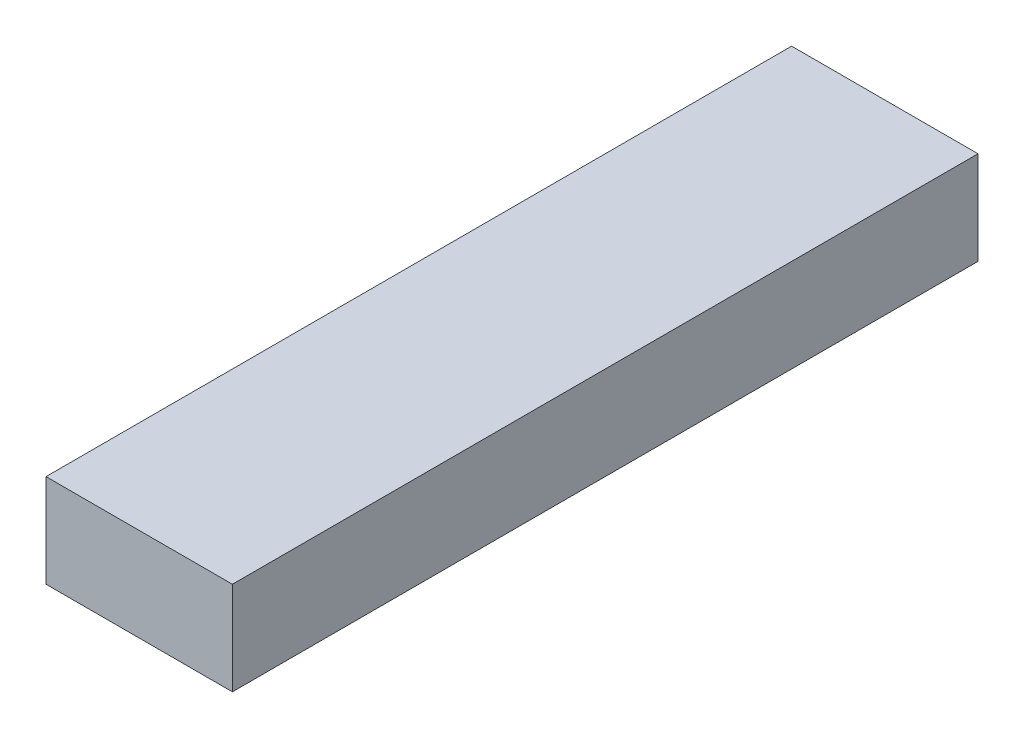
ISO-10303-21;
HEADER;
FILE_DESCRIPTION(('STEP AP214'),'2;1');
FILE_NAME('part.step','',(''),(''),'','','');
FILE_SCHEMA(('AUTOMOTIVE_DESIGN { 1 0 10303 214 1 1 1 1 }'));
ENDSEC;
DATA;
#1=APPLICATION_CONTEXT('core data for automotive mechanical design processes');
#2=APPLICATION_PROTOCOL_DEFINITION('international standard','automotive_design',2000,#1);
#3=PRODUCT_CONTEXT('',#1,'mechanical');
#4=PRODUCT('Part','Part','',(#3));
#5=PRODUCT_RELATED_PRODUCT_CATEGORY('part','',(#4));
#6=PRODUCT_DEFINITION_FORMATION('','',#4);
#7=PRODUCT_DEFINITION_CONTEXT('part definition',#1,'design');
#8=PRODUCT_DEFINITION('design','',#6,#7);
#9=PRODUCT_DEFINITION_SHAPE('','',#8);
#10=(LENGTH_UNIT() NAMED_UNIT(*) SI_UNIT(.MILLI.,.METRE.));
#11=(NAMED_UNIT(*) PLANE_ANGLE_UNIT() SI_UNIT($,.RADIAN.));
#12=(NAMED_UNIT(*) SI_UNIT($,.STERADIAN.) SOLID_ANGLE_UNIT());
#13=UNCERTAINTY_MEASURE_WITH_UNIT(LENGTH_MEASURE(1.E-05),#10,'distance_accuracy_value','');
#14=(GEOMETRIC_REPRESENTATION_CONTEXT(3) GLOBAL_UNCERTAINTY_ASSIGNED_CONTEXT((#13)) GLOBAL_UNIT_ASSIGNED_CONTEXT((#10,
#11,#12)) REPRESENTATION_CONTEXT('',''));
#15=CARTESIAN_POINT('',(0.,0.,0.));
#16=DIRECTION('',(0.,0.,1.));
#17=DIRECTION('',(1.,0.,0.));
#18=AXIS2_PLACEMENT_3D('',#15,#16,#17);
#19=CARTESIAN_POINT('',(0.,0.,0.));
#20=DIRECTION('',(0.,0.,-1.));
#21=DIRECTION('',(-1.,0.,0.));
#22=AXIS2_PLACEMENT_3D('',#19,#20,#21);
#23=PLANE('',#22);
#24=DIRECTION('',(0.,-1.,0.));
#25=VECTOR('',#24,1.);
#26=CARTESIAN_POINT('',(-5.,-2.5,0.));
#27=LINE('',#26,#25);
#28=CARTESIAN_POINT('',(-5.,2.5,0.));
#29=VERTEX_POINT('',#28);
#30=CARTESIAN_POINT('',(-5.,-2.5,0.));
#31=VERTEX_POINT('',#30);
#32=EDGE_CURVE('E77',#29,#31,#27,.T.);
#33=ORIENTED_EDGE('',*,*,#32,.F.);
#34=DIRECTION('',(-1.,0.,0.));
#35=VECTOR('',#34,1.);
#36=CARTESIAN_POINT('',(-5.,2.5,0.));
#37=LINE('',#36,#35);
#38=CARTESIAN_POINT('',(5.,2.5,0.));
#39=VERTEX_POINT('',#38);
#40=EDGE_CURVE('E85',#39,#29,#37,.T.);
#41=ORIENTED_EDGE('',*,*,#40,.F.);
#42=DIRECTION('',(0.,1.,0.));
#43=VECTOR('',#42,1.);
#44=CARTESIAN_POINT('',(5.,-2.5,0.));
#45=LINE('',#44,#43);
#46=CARTESIAN_POINT('',(5.,-2.5,0.));
#47=VERTEX_POINT('',#46);
#48=EDGE_CURVE('E81',#47,#39,#45,.T.);
#49=ORIENTED_EDGE('',*,*,#48,.F.);
#50=DIRECTION('',(1.,0.,0.));
#51=VECTOR('',#50,1.);
#52=CARTESIAN_POINT('',(-5.,-2.5,0.));
#53=LINE('',#52,#51);
#54=EDGE_CURVE('E71',#31,#47,#53,.T.);
#55=ORIENTED_EDGE('',*,*,#54,.F.);
#56=EDGE_LOOP('',(#33,#41,#49,#55));
#57=FACE_BOUND('',#56,.T.);
#58=ADVANCED_FACE('F43',(#57),#23,.T.);
#59=CARTESIAN_POINT('',(0.,0.,40.));
#60=DIRECTION('',(0.,0.,-1.));
#61=DIRECTION('',(-1.,0.,0.));
#62=AXIS2_PLACEMENT_3D('',#59,#60,#61);
#63=PLANE('',#62);
#64=DIRECTION('',(0.,-1.,0.));
#65=VECTOR('',#64,1.);
#66=CARTESIAN_POINT('',(-5.,-2.5,40.));
#67=LINE('',#66,#65);
#68=CARTESIAN_POINT('',(-5.,2.5,40.));
#69=VERTEX_POINT('',#68);
#70=CARTESIAN_POINT('',(-5.,-2.5,40.));
#71=VERTEX_POINT('',#70);
#72=EDGE_CURVE('E57',#69,#71,#67,.T.);
#73=ORIENTED_EDGE('',*,*,#72,.T.);
#74=DIRECTION('',(1.,0.,0.));
#75=VECTOR('',#74,1.);
#76=CARTESIAN_POINT('',(-5.,-2.5,40.));
#77=LINE('',#76,#75);
#78=CARTESIAN_POINT('',(5.,-2.5,40.));
#79=VERTEX_POINT('',#78);
#80=EDGE_CURVE('E11',#71,#79,#77,.T.);
#81=ORIENTED_EDGE('',*,*,#80,.T.);
#82=DIRECTION('',(0.,1.,0.));
#83=VECTOR('',#82,1.);
#84=CARTESIAN_POINT('',(5.,-2.5,40.));
#85=LINE('',#84,#83);
#86=CARTESIAN_POINT('',(5.,2.5,40.));
#87=VERTEX_POINT('',#86);
#88=EDGE_CURVE('E97',#79,#87,#85,.T.);
#89=ORIENTED_EDGE('',*,*,#88,.T.);
#90=DIRECTION('',(-1.,0.,0.));
#91=VECTOR('',#90,1.);
#92=CARTESIAN_POINT('',(-5.,2.5,40.));
#93=LINE('',#92,#91);
#94=EDGE_CURVE('E65',#87,#69,#93,.T.);
#95=ORIENTED_EDGE('',*,*,#94,.T.);
#96=EDGE_LOOP('',(#73,#81,#89,#95));
#97=FACE_BOUND('',#96,.T.);
#98=ADVANCED_FACE('F124',(#97),#63,.F.);
#99=CARTESIAN_POINT('',(5.,-2.5,0.));
#100=DIRECTION('',(1.,0.,0.));
#101=DIRECTION('',(0.,0.,-1.));
#102=AXIS2_PLACEMENT_3D('',#99,#100,#101);
#103=PLANE('',#102);
#104=DIRECTION('',(0.,0.,1.));
#105=VECTOR('',#104,1.);
#106=CARTESIAN_POINT('',(5.,2.5,0.));
#107=LINE('',#106,#105);
#108=EDGE_CURVE('E101',#39,#87,#107,.T.);
#109=ORIENTED_EDGE('',*,*,#108,.T.);
#110=ORIENTED_EDGE('',*,*,#88,.F.);
#111=DIRECTION('',(0.,0.,1.));
#112=VECTOR('',#111,1.);
#113=CARTESIAN_POINT('',(5.,-2.5,0.));
#114=LINE('',#113,#112);
#115=EDGE_CURVE('E92',#47,#79,#114,.T.);
#116=ORIENTED_EDGE('',*,*,#115,.F.);
#117=ORIENTED_EDGE('',*,*,#48,.T.);
#118=EDGE_LOOP('',(#109,#110,#116,#117));
#119=FACE_BOUND('',#118,.T.);
#120=ADVANCED_FACE('F98',(#119),#103,.T.);
#121=CARTESIAN_POINT('',(-5.,2.5,0.));
#122=DIRECTION('',(0.,1.,0.));
#123=DIRECTION('',(0.,0.,1.));
#124=AXIS2_PLACEMENT_3D('',#121,#122,#123);
#125=PLANE('',#124);
#126=DIRECTION('',(0.,0.,1.));
#127=VECTOR('',#126,1.);
#128=CARTESIAN_POINT('',(-5.,2.5,0.));
#129=LINE('',#128,#127);
#130=EDGE_CURVE('E110',#29,#69,#129,.T.);
#131=ORIENTED_EDGE('',*,*,#130,.T.);
#132=ORIENTED_EDGE('',*,*,#94,.F.);
#133=ORIENTED_EDGE('',*,*,#108,.F.);
#134=ORIENTED_EDGE('',*,*,#40,.T.);
#135=EDGE_LOOP('',(#131,#132,#133,#134));
#136=FACE_BOUND('',#135,.T.);
#137=ADVANCED_FACE('F116',(#136),#125,.T.);
#138=CARTESIAN_POINT('',(-5.,-2.5,0.));
#139=DIRECTION('',(-1.,0.,0.));
#140=DIRECTION('',(0.,0.,1.));
#141=AXIS2_PLACEMENT_3D('',#138,#139,#140);
#142=PLANE('',#141);
#143=DIRECTION('',(0.,0.,1.));
#144=VECTOR('',#143,1.);
#145=CARTESIAN_POINT('',(-5.,-2.5,0.));
#146=LINE('',#145,#144);
#147=EDGE_CURVE('E49',#31,#71,#146,.T.);
#148=ORIENTED_EDGE('',*,*,#147,.T.);
#149=ORIENTED_EDGE('',*,*,#72,.F.);
#150=ORIENTED_EDGE('',*,*,#130,.F.);
#151=ORIENTED_EDGE('',*,*,#32,.T.);
#152=EDGE_LOOP('',(#148,#149,#150,#151));
#153=FACE_BOUND('',#152,.T.);
#154=ADVANCED_FACE('F114',(#153),#142,.T.);
#155=CARTESIAN_POINT('',(-5.,-2.5,0.));
#156=DIRECTION('',(0.,-1.,0.));
#157=DIRECTION('',(0.,0.,-1.));
#158=AXIS2_PLACEMENT_3D('',#155,#156,#157);
#159=PLANE('',#158);
#160=ORIENTED_EDGE('',*,*,#80,.F.);
#161=ORIENTED_EDGE('',*,*,#147,.F.);
#162=ORIENTED_EDGE('',*,*,#54,.T.);
#163=ORIENTED_EDGE('',*,*,#115,.T.);
#164=EDGE_LOOP('',(#160,#161,#162,#163));
#165=FACE_BOUND('',#164,.T.);
#166=ADVANCED_FACE('F94',(#165),#159,.T.);
#167=CLOSED_SHELL('',(#58,#98,#120,#137,#154,#166));
#168=MANIFOLD_SOLID_BREP('B2',#167);
#169=ADVANCED_BREP_SHAPE_REPRESENTATION('',(#18,#168),#14);
#170=SHAPE_DEFINITION_REPRESENTATION(#9,#169);
ENDSEC;
END-ISO-10303-21;
